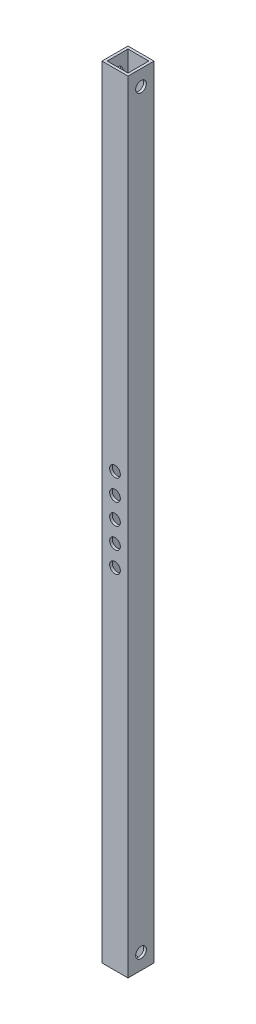
ISO-10303-21;
HEADER;
FILE_DESCRIPTION(('STEP AP214'),'2;1');
FILE_NAME('part.step','',(''),(''),'','','');
FILE_SCHEMA(('AUTOMOTIVE_DESIGN { 1 0 10303 214 1 1 1 1 }'));
ENDSEC;
DATA;
#1=APPLICATION_CONTEXT('core data for automotive mechanical design processes');
#2=APPLICATION_PROTOCOL_DEFINITION('international standard','automotive_design',2000,#1);
#3=PRODUCT_CONTEXT('',#1,'mechanical');
#4=PRODUCT('Part','Part','',(#3));
#5=PRODUCT_RELATED_PRODUCT_CATEGORY('part','',(#4));
#6=PRODUCT_DEFINITION_FORMATION('','',#4);
#7=PRODUCT_DEFINITION_CONTEXT('part definition',#1,'design');
#8=PRODUCT_DEFINITION('design','',#6,#7);
#9=PRODUCT_DEFINITION_SHAPE('','',#8);
#10=(LENGTH_UNIT() NAMED_UNIT(*) SI_UNIT(.MILLI.,.METRE.));
#11=(NAMED_UNIT(*) PLANE_ANGLE_UNIT() SI_UNIT($,.RADIAN.));
#12=(NAMED_UNIT(*) SI_UNIT($,.STERADIAN.) SOLID_ANGLE_UNIT());
#13=UNCERTAINTY_MEASURE_WITH_UNIT(LENGTH_MEASURE(1.E-05),#10,'distance_accuracy_value','');
#14=(GEOMETRIC_REPRESENTATION_CONTEXT(3) GLOBAL_UNCERTAINTY_ASSIGNED_CONTEXT((#13)) GLOBAL_UNIT_ASSIGNED_CONTEXT((#10,
#11,#12)) REPRESENTATION_CONTEXT('',''));
#15=CARTESIAN_POINT('',(0.,0.,0.));
#16=DIRECTION('',(0.,0.,1.));
#17=DIRECTION('',(1.,0.,0.));
#18=AXIS2_PLACEMENT_3D('',#15,#16,#17);
#19=CARTESIAN_POINT('',(0.,300.,0.));
#20=DIRECTION('',(0.,1.,0.));
#21=DIRECTION('',(0.,0.,1.));
#22=AXIS2_PLACEMENT_3D('',#19,#20,#21);
#23=PLANE('',#22);
#24=DIRECTION('',(0.,0.,-1.));
#25=VECTOR('',#24,1.);
#26=CARTESIAN_POINT('',(5.,300.,-5.));
#27=LINE('',#26,#25);
#28=CARTESIAN_POINT('',(5.,300.,5.));
#29=VERTEX_POINT('',#28);
#30=CARTESIAN_POINT('',(5.,300.,-5.));
#31=VERTEX_POINT('',#30);
#32=EDGE_CURVE('E142',#29,#31,#27,.T.);
#33=ORIENTED_EDGE('',*,*,#32,.T.);
#34=DIRECTION('',(-1.,0.,0.));
#35=VECTOR('',#34,1.);
#36=CARTESIAN_POINT('',(-5.,300.,-5.));
#37=LINE('',#36,#35);
#38=CARTESIAN_POINT('',(-5.,300.,-5.));
#39=VERTEX_POINT('',#38);
#40=EDGE_CURVE('E145',#31,#39,#37,.T.);
#41=ORIENTED_EDGE('',*,*,#40,.T.);
#42=DIRECTION('',(0.,0.,1.));
#43=VECTOR('',#42,1.);
#44=CARTESIAN_POINT('',(-5.,300.,-5.));
#45=LINE('',#44,#43);
#46=CARTESIAN_POINT('',(-5.,300.,5.));
#47=VERTEX_POINT('',#46);
#48=EDGE_CURVE('E148',#39,#47,#45,.T.);
#49=ORIENTED_EDGE('',*,*,#48,.T.);
#50=DIRECTION('',(1.,0.,0.));
#51=VECTOR('',#50,1.);
#52=CARTESIAN_POINT('',(-5.,300.,5.));
#53=LINE('',#52,#51);
#54=EDGE_CURVE('E150',#47,#29,#53,.T.);
#55=ORIENTED_EDGE('',*,*,#54,.T.);
#56=EDGE_LOOP('',(#33,#41,#49,#55));
#57=FACE_BOUND('',#56,.T.);
#58=DIRECTION('',(-1.,0.,0.));
#59=VECTOR('',#58,1.);
#60=CARTESIAN_POINT('',(-4.,300.,-4.));
#61=LINE('',#60,#59);
#62=CARTESIAN_POINT('',(4.,300.,-4.));
#63=VERTEX_POINT('',#62);
#64=CARTESIAN_POINT('',(-4.,300.,-4.));
#65=VERTEX_POINT('',#64);
#66=EDGE_CURVE('E112',#63,#65,#61,.T.);
#67=ORIENTED_EDGE('',*,*,#66,.F.);
#68=DIRECTION('',(0.,0.,-1.));
#69=VECTOR('',#68,1.);
#70=CARTESIAN_POINT('',(4.,300.,-4.));
#71=LINE('',#70,#69);
#72=CARTESIAN_POINT('',(4.,300.,4.));
#73=VERTEX_POINT('',#72);
#74=EDGE_CURVE('E104',#73,#63,#71,.T.);
#75=ORIENTED_EDGE('',*,*,#74,.F.);
#76=DIRECTION('',(1.,0.,0.));
#77=VECTOR('',#76,1.);
#78=CARTESIAN_POINT('',(-4.,300.,4.));
#79=LINE('',#78,#77);
#80=CARTESIAN_POINT('',(-4.,300.,4.));
#81=VERTEX_POINT('',#80);
#82=EDGE_CURVE('E126',#81,#73,#79,.T.);
#83=ORIENTED_EDGE('',*,*,#82,.F.);
#84=DIRECTION('',(0.,0.,1.));
#85=VECTOR('',#84,1.);
#86=CARTESIAN_POINT('',(-4.,300.,-4.));
#87=LINE('',#86,#85);
#88=EDGE_CURVE('E124',#65,#81,#87,.T.);
#89=ORIENTED_EDGE('',*,*,#88,.F.);
#90=EDGE_LOOP('',(#67,#75,#83,#89));
#91=FACE_BOUND('',#90,.T.);
#92=ADVANCED_FACE('F37',(#57,#91),#23,.T.);
#93=CARTESIAN_POINT('',(0.,0.,0.));
#94=DIRECTION('',(0.,1.,0.));
#95=DIRECTION('',(0.,0.,1.));
#96=AXIS2_PLACEMENT_3D('',#93,#94,#95);
#97=PLANE('',#96);
#98=DIRECTION('',(0.,0.,-1.));
#99=VECTOR('',#98,1.);
#100=CARTESIAN_POINT('',(5.,0.,-5.));
#101=LINE('',#100,#99);
#102=CARTESIAN_POINT('',(5.,0.,5.));
#103=VERTEX_POINT('',#102);
#104=CARTESIAN_POINT('',(5.,0.,-5.));
#105=VERTEX_POINT('',#104);
#106=EDGE_CURVE('E120',#103,#105,#101,.T.);
#107=ORIENTED_EDGE('',*,*,#106,.F.);
#108=DIRECTION('',(1.,0.,0.));
#109=VECTOR('',#108,1.);
#110=CARTESIAN_POINT('',(-5.,0.,5.));
#111=LINE('',#110,#109);
#112=CARTESIAN_POINT('',(-5.,0.,5.));
#113=VERTEX_POINT('',#112);
#114=EDGE_CURVE('E146',#113,#103,#111,.T.);
#115=ORIENTED_EDGE('',*,*,#114,.F.);
#116=DIRECTION('',(0.,0.,1.));
#117=VECTOR('',#116,1.);
#118=CARTESIAN_POINT('',(-5.,0.,-5.));
#119=LINE('',#118,#117);
#120=CARTESIAN_POINT('',(-5.,0.,-5.));
#121=VERTEX_POINT('',#120);
#122=EDGE_CURVE('E157',#121,#113,#119,.T.);
#123=ORIENTED_EDGE('',*,*,#122,.F.);
#124=DIRECTION('',(-1.,0.,0.));
#125=VECTOR('',#124,1.);
#126=CARTESIAN_POINT('',(-5.,0.,-5.));
#127=LINE('',#126,#125);
#128=EDGE_CURVE('E155',#105,#121,#127,.T.);
#129=ORIENTED_EDGE('',*,*,#128,.F.);
#130=EDGE_LOOP('',(#107,#115,#123,#129));
#131=FACE_BOUND('',#130,.T.);
#132=DIRECTION('',(0.,0.,-1.));
#133=VECTOR('',#132,1.);
#134=CARTESIAN_POINT('',(4.,0.,-4.));
#135=LINE('',#134,#133);
#136=CARTESIAN_POINT('',(4.,0.,4.));
#137=VERTEX_POINT('',#136);
#138=CARTESIAN_POINT('',(4.,0.,-4.));
#139=VERTEX_POINT('',#138);
#140=EDGE_CURVE('E62',#137,#139,#135,.T.);
#141=ORIENTED_EDGE('',*,*,#140,.T.);
#142=DIRECTION('',(-1.,0.,0.));
#143=VECTOR('',#142,1.);
#144=CARTESIAN_POINT('',(-4.,0.,-4.));
#145=LINE('',#144,#143);
#146=CARTESIAN_POINT('',(-4.,0.,-4.));
#147=VERTEX_POINT('',#146);
#148=EDGE_CURVE('E119',#139,#147,#145,.T.);
#149=ORIENTED_EDGE('',*,*,#148,.T.);
#150=DIRECTION('',(0.,0.,1.));
#151=VECTOR('',#150,1.);
#152=CARTESIAN_POINT('',(-4.,0.,-4.));
#153=LINE('',#152,#151);
#154=CARTESIAN_POINT('',(-4.,0.,4.));
#155=VERTEX_POINT('',#154);
#156=EDGE_CURVE('E134',#147,#155,#153,.T.);
#157=ORIENTED_EDGE('',*,*,#156,.T.);
#158=DIRECTION('',(1.,0.,0.));
#159=VECTOR('',#158,1.);
#160=CARTESIAN_POINT('',(-4.,0.,4.));
#161=LINE('',#160,#159);
#162=EDGE_CURVE('E113',#155,#137,#161,.T.);
#163=ORIENTED_EDGE('',*,*,#162,.T.);
#164=EDGE_LOOP('',(#141,#149,#157,#163));
#165=FACE_BOUND('',#164,.T.);
#166=ADVANCED_FACE('F239',(#131,#165),#97,.F.);
#167=CARTESIAN_POINT('',(5.,300.,-5.));
#168=DIRECTION('',(-1.,0.,0.));
#169=DIRECTION('',(0.,0.,1.));
#170=AXIS2_PLACEMENT_3D('',#167,#168,#169);
#171=PLANE('',#170);
#172=CARTESIAN_POINT('',(5.,294.,0.));
#173=DIRECTION('',(1.,0.,0.));
#174=DIRECTION('',(0.,0.,-1.));
#175=AXIS2_PLACEMENT_3D('',#172,#173,#174);
#176=CIRCLE('',#175,2.05000000000001);
#177=CARTESIAN_POINT('',(5.,294.,-2.05));
#178=VERTEX_POINT('',#177);
#179=EDGE_CURVE('E207',#178,#178,#176,.T.);
#180=ORIENTED_EDGE('',*,*,#179,.F.);
#181=EDGE_LOOP('',(#180));
#182=FACE_BOUND('',#181,.T.);
#183=CARTESIAN_POINT('',(5.,6.00000000000001,0.));
#184=DIRECTION('',(1.,0.,0.));
#185=DIRECTION('',(0.,0.,1.));
#186=AXIS2_PLACEMENT_3D('',#183,#184,#185);
#187=CIRCLE('',#186,2.05);
#188=CARTESIAN_POINT('',(5.,6.00000000000001,2.05));
#189=VERTEX_POINT('',#188);
#190=EDGE_CURVE('E204',#189,#189,#187,.T.);
#191=ORIENTED_EDGE('',*,*,#190,.F.);
#192=EDGE_LOOP('',(#191));
#193=FACE_BOUND('',#192,.T.);
#194=ORIENTED_EDGE('',*,*,#106,.T.);
#195=DIRECTION('',(0.,-1.,0.));
#196=VECTOR('',#195,1.);
#197=CARTESIAN_POINT('',(5.,300.,-5.));
#198=LINE('',#197,#196);
#199=EDGE_CURVE('E11',#31,#105,#198,.T.);
#200=ORIENTED_EDGE('',*,*,#199,.F.);
#201=ORIENTED_EDGE('',*,*,#32,.F.);
#202=DIRECTION('',(0.,-1.,0.));
#203=VECTOR('',#202,1.);
#204=CARTESIAN_POINT('',(5.,300.,5.));
#205=LINE('',#204,#203);
#206=EDGE_CURVE('E152',#29,#103,#205,.T.);
#207=ORIENTED_EDGE('',*,*,#206,.T.);
#208=EDGE_LOOP('',(#194,#200,#201,#207));
#209=FACE_BOUND('',#208,.T.);
#210=ADVANCED_FACE('F39',(#182,#193,#209),#171,.F.);
#211=CARTESIAN_POINT('',(-5.,300.,-5.));
#212=DIRECTION('',(0.,0.,1.));
#213=DIRECTION('',(1.,0.,0.));
#214=AXIS2_PLACEMENT_3D('',#211,#212,#213);
#215=PLANE('',#214);
#216=CARTESIAN_POINT('',(1.77019727681013E-13,134.,-5.));
#217=DIRECTION('',(0.,0.,1.));
#218=DIRECTION('',(1.,0.,0.));
#219=AXIS2_PLACEMENT_3D('',#216,#217,#218);
#220=CIRCLE('',#219,2.05);
#221=CARTESIAN_POINT('',(2.05000000000017,134.,-5.));
#222=VERTEX_POINT('',#221);
#223=EDGE_CURVE('E352',#222,#222,#220,.T.);
#224=ORIENTED_EDGE('',*,*,#223,.T.);
#225=EDGE_LOOP('',(#224));
#226=FACE_BOUND('',#225,.T.);
#227=CARTESIAN_POINT('',(0.,142.,-5.));
#228=DIRECTION('',(0.,0.,1.));
#229=DIRECTION('',(1.,0.,0.));
#230=AXIS2_PLACEMENT_3D('',#227,#228,#229);
#231=CIRCLE('',#230,2.05);
#232=CARTESIAN_POINT('',(2.05000000000009,142.,-5.));
#233=VERTEX_POINT('',#232);
#234=EDGE_CURVE('E346',#233,#233,#231,.T.);
#235=ORIENTED_EDGE('',*,*,#234,.T.);
#236=EDGE_LOOP('',(#235));
#237=FACE_BOUND('',#236,.T.);
#238=CARTESIAN_POINT('',(0.,166.,-5.));
#239=DIRECTION('',(0.,0.,1.));
#240=DIRECTION('',(1.,0.,0.));
#241=AXIS2_PLACEMENT_3D('',#238,#239,#240);
#242=CIRCLE('',#241,2.05);
#243=CARTESIAN_POINT('',(2.04999999999995,166.,-5.));
#244=VERTEX_POINT('',#243);
#245=EDGE_CURVE('E338',#244,#244,#242,.T.);
#246=ORIENTED_EDGE('',*,*,#245,.T.);
#247=EDGE_LOOP('',(#246));
#248=FACE_BOUND('',#247,.T.);
#249=CARTESIAN_POINT('',(0.,158.,-5.));
#250=DIRECTION('',(0.,0.,1.));
#251=DIRECTION('',(1.,0.,0.));
#252=AXIS2_PLACEMENT_3D('',#249,#250,#251);
#253=CIRCLE('',#252,2.05);
#254=CARTESIAN_POINT('',(2.04999999999998,158.,-5.));
#255=VERTEX_POINT('',#254);
#256=EDGE_CURVE('E330',#255,#255,#253,.T.);
#257=ORIENTED_EDGE('',*,*,#256,.T.);
#258=EDGE_LOOP('',(#257));
#259=FACE_BOUND('',#258,.T.);
#260=CARTESIAN_POINT('',(0.,150.,-5.));
#261=DIRECTION('',(0.,0.,1.));
#262=DIRECTION('',(1.,0.,0.));
#263=AXIS2_PLACEMENT_3D('',#260,#261,#262);
#264=CIRCLE('',#263,2.05);
#265=CARTESIAN_POINT('',(2.05000000000001,150.,-5.));
#266=VERTEX_POINT('',#265);
#267=EDGE_CURVE('E179',#266,#266,#264,.T.);
#268=ORIENTED_EDGE('',*,*,#267,.T.);
#269=EDGE_LOOP('',(#268));
#270=FACE_BOUND('',#269,.T.);
#271=ORIENTED_EDGE('',*,*,#128,.T.);
#272=DIRECTION('',(0.,-1.,0.));
#273=VECTOR('',#272,1.);
#274=CARTESIAN_POINT('',(-5.,300.,-5.));
#275=LINE('',#274,#273);
#276=EDGE_CURVE('E46',#39,#121,#275,.T.);
#277=ORIENTED_EDGE('',*,*,#276,.F.);
#278=ORIENTED_EDGE('',*,*,#40,.F.);
#279=ORIENTED_EDGE('',*,*,#199,.T.);
#280=EDGE_LOOP('',(#271,#277,#278,#279));
#281=FACE_BOUND('',#280,.T.);
#282=ADVANCED_FACE('F238',(#226,#237,#248,#259,#270,#281),#215,.F.);
#283=CARTESIAN_POINT('',(-5.,300.,-5.));
#284=DIRECTION('',(1.,0.,0.));
#285=DIRECTION('',(0.,0.,-1.));
#286=AXIS2_PLACEMENT_3D('',#283,#284,#285);
#287=PLANE('',#286);
#288=CARTESIAN_POINT('',(-5.,294.,0.));
#289=DIRECTION('',(1.,0.,0.));
#290=DIRECTION('',(0.,0.,-1.));
#291=AXIS2_PLACEMENT_3D('',#288,#289,#290);
#292=CIRCLE('',#291,2.05000000000001);
#293=CARTESIAN_POINT('',(-5.,294.,-2.05));
#294=VERTEX_POINT('',#293);
#295=EDGE_CURVE('E171',#294,#294,#292,.T.);
#296=ORIENTED_EDGE('',*,*,#295,.T.);
#297=EDGE_LOOP('',(#296));
#298=FACE_BOUND('',#297,.T.);
#299=CARTESIAN_POINT('',(-5.,6.00000000000001,0.));
#300=DIRECTION('',(1.,0.,0.));
#301=DIRECTION('',(0.,0.,1.));
#302=AXIS2_PLACEMENT_3D('',#299,#300,#301);
#303=CIRCLE('',#302,2.05);
#304=CARTESIAN_POINT('',(-5.,6.00000000000001,2.05));
#305=VERTEX_POINT('',#304);
#306=EDGE_CURVE('E210',#305,#305,#303,.T.);
#307=ORIENTED_EDGE('',*,*,#306,.T.);
#308=EDGE_LOOP('',(#307));
#309=FACE_BOUND('',#308,.T.);
#310=ORIENTED_EDGE('',*,*,#122,.T.);
#311=DIRECTION('',(0.,-1.,0.));
#312=VECTOR('',#311,1.);
#313=CARTESIAN_POINT('',(-5.,300.,5.));
#314=LINE('',#313,#312);
#315=EDGE_CURVE('E162',#47,#113,#314,.T.);
#316=ORIENTED_EDGE('',*,*,#315,.F.);
#317=ORIENTED_EDGE('',*,*,#48,.F.);
#318=ORIENTED_EDGE('',*,*,#276,.T.);
#319=EDGE_LOOP('',(#310,#316,#317,#318));
#320=FACE_BOUND('',#319,.T.);
#321=ADVANCED_FACE('F257',(#298,#309,#320),#287,.F.);
#322=CARTESIAN_POINT('',(-5.,300.,5.));
#323=DIRECTION('',(0.,0.,-1.));
#324=DIRECTION('',(-1.,0.,0.));
#325=AXIS2_PLACEMENT_3D('',#322,#323,#324);
#326=PLANE('',#325);
#327=CARTESIAN_POINT('',(1.77019727681013E-13,134.,5.));
#328=DIRECTION('',(0.,0.,1.));
#329=DIRECTION('',(1.,0.,0.));
#330=AXIS2_PLACEMENT_3D('',#327,#328,#329);
#331=CIRCLE('',#330,2.05);
#332=CARTESIAN_POINT('',(2.05000000000017,134.,5.));
#333=VERTEX_POINT('',#332);
#334=EDGE_CURVE('E355',#333,#333,#331,.T.);
#335=ORIENTED_EDGE('',*,*,#334,.F.);
#336=EDGE_LOOP('',(#335));
#337=FACE_BOUND('',#336,.T.);
#338=CARTESIAN_POINT('',(0.,142.,5.));
#339=DIRECTION('',(0.,0.,1.));
#340=DIRECTION('',(1.,0.,0.));
#341=AXIS2_PLACEMENT_3D('',#338,#339,#340);
#342=CIRCLE('',#341,2.05);
#343=CARTESIAN_POINT('',(2.05000000000009,142.,5.));
#344=VERTEX_POINT('',#343);
#345=EDGE_CURVE('E349',#344,#344,#342,.T.);
#346=ORIENTED_EDGE('',*,*,#345,.F.);
#347=EDGE_LOOP('',(#346));
#348=FACE_BOUND('',#347,.T.);
#349=CARTESIAN_POINT('',(0.,166.,5.));
#350=DIRECTION('',(0.,0.,1.));
#351=DIRECTION('',(1.,0.,0.));
#352=AXIS2_PLACEMENT_3D('',#349,#350,#351);
#353=CIRCLE('',#352,2.05);
#354=CARTESIAN_POINT('',(2.04999999999995,166.,5.));
#355=VERTEX_POINT('',#354);
#356=EDGE_CURVE('E343',#355,#355,#353,.T.);
#357=ORIENTED_EDGE('',*,*,#356,.F.);
#358=EDGE_LOOP('',(#357));
#359=FACE_BOUND('',#358,.T.);
#360=CARTESIAN_POINT('',(0.,158.,5.));
#361=DIRECTION('',(0.,0.,1.));
#362=DIRECTION('',(1.,0.,0.));
#363=AXIS2_PLACEMENT_3D('',#360,#361,#362);
#364=CIRCLE('',#363,2.05);
#365=CARTESIAN_POINT('',(2.04999999999998,158.,5.));
#366=VERTEX_POINT('',#365);
#367=EDGE_CURVE('E333',#366,#366,#364,.T.);
#368=ORIENTED_EDGE('',*,*,#367,.F.);
#369=EDGE_LOOP('',(#368));
#370=FACE_BOUND('',#369,.T.);
#371=CARTESIAN_POINT('',(0.,150.,5.));
#372=DIRECTION('',(0.,0.,1.));
#373=DIRECTION('',(1.,0.,0.));
#374=AXIS2_PLACEMENT_3D('',#371,#372,#373);
#375=CIRCLE('',#374,2.05);
#376=CARTESIAN_POINT('',(2.05000000000001,150.,5.));
#377=VERTEX_POINT('',#376);
#378=EDGE_CURVE('E332',#377,#377,#375,.T.);
#379=ORIENTED_EDGE('',*,*,#378,.F.);
#380=EDGE_LOOP('',(#379));
#381=FACE_BOUND('',#380,.T.);
#382=ORIENTED_EDGE('',*,*,#114,.T.);
#383=ORIENTED_EDGE('',*,*,#206,.F.);
#384=ORIENTED_EDGE('',*,*,#54,.F.);
#385=ORIENTED_EDGE('',*,*,#315,.T.);
#386=EDGE_LOOP('',(#382,#383,#384,#385));
#387=FACE_BOUND('',#386,.T.);
#388=ADVANCED_FACE('F224',(#337,#348,#359,#370,#381,#387),#326,.F.);
#389=CARTESIAN_POINT('',(4.,300.,-4.));
#390=DIRECTION('',(-1.,0.,0.));
#391=DIRECTION('',(0.,0.,1.));
#392=AXIS2_PLACEMENT_3D('',#389,#390,#391);
#393=PLANE('',#392);
#394=CARTESIAN_POINT('',(4.,294.,0.));
#395=DIRECTION('',(-1.,0.,0.));
#396=DIRECTION('',(0.,0.,1.));
#397=AXIS2_PLACEMENT_3D('',#394,#395,#396);
#398=CIRCLE('',#397,2.05000000000001);
#399=CARTESIAN_POINT('',(4.,294.,2.05000000000002));
#400=VERTEX_POINT('',#399);
#401=EDGE_CURVE('E132',#400,#400,#398,.T.);
#402=ORIENTED_EDGE('',*,*,#401,.F.);
#403=EDGE_LOOP('',(#402));
#404=FACE_BOUND('',#403,.T.);
#405=CARTESIAN_POINT('',(4.,6.00000000000001,0.));
#406=DIRECTION('',(-1.,0.,0.));
#407=DIRECTION('',(0.,0.,1.));
#408=AXIS2_PLACEMENT_3D('',#405,#406,#407);
#409=CIRCLE('',#408,2.05);
#410=CARTESIAN_POINT('',(4.,6.00000000000001,2.05));
#411=VERTEX_POINT('',#410);
#412=EDGE_CURVE('E170',#411,#411,#409,.T.);
#413=ORIENTED_EDGE('',*,*,#412,.F.);
#414=EDGE_LOOP('',(#413));
#415=FACE_BOUND('',#414,.T.);
#416=ORIENTED_EDGE('',*,*,#140,.F.);
#417=DIRECTION('',(0.,-1.,0.));
#418=VECTOR('',#417,1.);
#419=CARTESIAN_POINT('',(4.,300.,4.));
#420=LINE('',#419,#418);
#421=EDGE_CURVE('E108',#73,#137,#420,.T.);
#422=ORIENTED_EDGE('',*,*,#421,.F.);
#423=ORIENTED_EDGE('',*,*,#74,.T.);
#424=DIRECTION('',(0.,-1.,0.));
#425=VECTOR('',#424,1.);
#426=CARTESIAN_POINT('',(4.,300.,-4.));
#427=LINE('',#426,#425);
#428=EDGE_CURVE('E107',#63,#139,#427,.T.);
#429=ORIENTED_EDGE('',*,*,#428,.T.);
#430=EDGE_LOOP('',(#416,#422,#423,#429));
#431=FACE_BOUND('',#430,.T.);
#432=ADVANCED_FACE('F106',(#404,#415,#431),#393,.T.);
#433=CARTESIAN_POINT('',(-4.,300.,-4.));
#434=DIRECTION('',(0.,0.,1.));
#435=DIRECTION('',(1.,0.,0.));
#436=AXIS2_PLACEMENT_3D('',#433,#434,#435);
#437=PLANE('',#436);
#438=CARTESIAN_POINT('',(1.77019727681013E-13,134.,-4.));
#439=DIRECTION('',(0.,0.,1.));
#440=DIRECTION('',(1.,0.,0.));
#441=AXIS2_PLACEMENT_3D('',#438,#439,#440);
#442=CIRCLE('',#441,2.05);
#443=CARTESIAN_POINT('',(2.05000000000017,134.,-4.));
#444=VERTEX_POINT('',#443);
#445=EDGE_CURVE('E201',#444,#444,#442,.T.);
#446=ORIENTED_EDGE('',*,*,#445,.F.);
#447=EDGE_LOOP('',(#446));
#448=FACE_BOUND('',#447,.T.);
#449=CARTESIAN_POINT('',(0.,142.,-4.));
#450=DIRECTION('',(0.,0.,1.));
#451=DIRECTION('',(1.,0.,0.));
#452=AXIS2_PLACEMENT_3D('',#449,#450,#451);
#453=CIRCLE('',#452,2.05);
#454=CARTESIAN_POINT('',(2.05000000000009,142.,-4.));
#455=VERTEX_POINT('',#454);
#456=EDGE_CURVE('E189',#455,#455,#453,.T.);
#457=ORIENTED_EDGE('',*,*,#456,.F.);
#458=EDGE_LOOP('',(#457));
#459=FACE_BOUND('',#458,.T.);
#460=CARTESIAN_POINT('',(0.,166.,-4.));
#461=DIRECTION('',(0.,0.,1.));
#462=DIRECTION('',(1.,0.,0.));
#463=AXIS2_PLACEMENT_3D('',#460,#461,#462);
#464=CIRCLE('',#463,2.05);
#465=CARTESIAN_POINT('',(2.04999999999995,166.,-4.));
#466=VERTEX_POINT('',#465);
#467=EDGE_CURVE('E186',#466,#466,#464,.T.);
#468=ORIENTED_EDGE('',*,*,#467,.F.);
#469=EDGE_LOOP('',(#468));
#470=FACE_BOUND('',#469,.T.);
#471=CARTESIAN_POINT('',(0.,158.,-4.));
#472=DIRECTION('',(0.,0.,1.));
#473=DIRECTION('',(1.,0.,0.));
#474=AXIS2_PLACEMENT_3D('',#471,#472,#473);
#475=CIRCLE('',#474,2.05);
#476=CARTESIAN_POINT('',(2.04999999999998,158.,-4.));
#477=VERTEX_POINT('',#476);
#478=EDGE_CURVE('E183',#477,#477,#475,.T.);
#479=ORIENTED_EDGE('',*,*,#478,.F.);
#480=EDGE_LOOP('',(#479));
#481=FACE_BOUND('',#480,.T.);
#482=CARTESIAN_POINT('',(0.,150.,-4.));
#483=DIRECTION('',(0.,0.,1.));
#484=DIRECTION('',(1.,0.,0.));
#485=AXIS2_PLACEMENT_3D('',#482,#483,#484);
#486=CIRCLE('',#485,2.05);
#487=CARTESIAN_POINT('',(2.05000000000001,150.,-4.));
#488=VERTEX_POINT('',#487);
#489=EDGE_CURVE('E178',#488,#488,#486,.T.);
#490=ORIENTED_EDGE('',*,*,#489,.F.);
#491=EDGE_LOOP('',(#490));
#492=FACE_BOUND('',#491,.T.);
#493=ORIENTED_EDGE('',*,*,#148,.F.);
#494=ORIENTED_EDGE('',*,*,#428,.F.);
#495=ORIENTED_EDGE('',*,*,#66,.T.);
#496=DIRECTION('',(0.,-1.,0.));
#497=VECTOR('',#496,1.);
#498=CARTESIAN_POINT('',(-4.,300.,-4.));
#499=LINE('',#498,#497);
#500=EDGE_CURVE('E121',#65,#147,#499,.T.);
#501=ORIENTED_EDGE('',*,*,#500,.T.);
#502=EDGE_LOOP('',(#493,#494,#495,#501));
#503=FACE_BOUND('',#502,.T.);
#504=ADVANCED_FACE('F116',(#448,#459,#470,#481,#492,#503),#437,.T.);
#505=CARTESIAN_POINT('',(-4.,300.,-4.));
#506=DIRECTION('',(1.,0.,0.));
#507=DIRECTION('',(0.,0.,-1.));
#508=AXIS2_PLACEMENT_3D('',#505,#506,#507);
#509=PLANE('',#508);
#510=CARTESIAN_POINT('',(-4.,294.,0.));
#511=DIRECTION('',(1.,0.,0.));
#512=DIRECTION('',(0.,0.,-1.));
#513=AXIS2_PLACEMENT_3D('',#510,#511,#512);
#514=CIRCLE('',#513,2.05000000000001);
#515=CARTESIAN_POINT('',(-4.,294.,-2.05));
#516=VERTEX_POINT('',#515);
#517=EDGE_CURVE('E172',#516,#516,#514,.T.);
#518=ORIENTED_EDGE('',*,*,#517,.F.);
#519=EDGE_LOOP('',(#518));
#520=FACE_BOUND('',#519,.T.);
#521=CARTESIAN_POINT('',(-4.,6.00000000000001,0.));
#522=DIRECTION('',(1.,0.,0.));
#523=DIRECTION('',(0.,0.,-1.));
#524=AXIS2_PLACEMENT_3D('',#521,#522,#523);
#525=CIRCLE('',#524,2.05);
#526=CARTESIAN_POINT('',(-4.,6.00000000000001,-2.05));
#527=VERTEX_POINT('',#526);
#528=EDGE_CURVE('E167',#527,#527,#525,.T.);
#529=ORIENTED_EDGE('',*,*,#528,.F.);
#530=EDGE_LOOP('',(#529));
#531=FACE_BOUND('',#530,.T.);
#532=ORIENTED_EDGE('',*,*,#156,.F.);
#533=ORIENTED_EDGE('',*,*,#500,.F.);
#534=ORIENTED_EDGE('',*,*,#88,.T.);
#535=DIRECTION('',(0.,-1.,0.));
#536=VECTOR('',#535,1.);
#537=CARTESIAN_POINT('',(-4.,300.,4.));
#538=LINE('',#537,#536);
#539=EDGE_CURVE('E54',#81,#155,#538,.T.);
#540=ORIENTED_EDGE('',*,*,#539,.T.);
#541=EDGE_LOOP('',(#532,#533,#534,#540));
#542=FACE_BOUND('',#541,.T.);
#543=ADVANCED_FACE('F278',(#520,#531,#542),#509,.T.);
#544=CARTESIAN_POINT('',(-4.,300.,4.));
#545=DIRECTION('',(0.,0.,-1.));
#546=DIRECTION('',(-1.,0.,0.));
#547=AXIS2_PLACEMENT_3D('',#544,#545,#546);
#548=PLANE('',#547);
#549=CARTESIAN_POINT('',(1.77019727681013E-13,134.,4.));
#550=DIRECTION('',(0.,0.,-1.));
#551=DIRECTION('',(-1.,0.,0.));
#552=AXIS2_PLACEMENT_3D('',#549,#550,#551);
#553=CIRCLE('',#552,2.05);
#554=CARTESIAN_POINT('',(-2.04999999999982,134.,4.));
#555=VERTEX_POINT('',#554);
#556=EDGE_CURVE('E41',#555,#555,#553,.T.);
#557=ORIENTED_EDGE('',*,*,#556,.F.);
#558=EDGE_LOOP('',(#557));
#559=FACE_BOUND('',#558,.T.);
#560=CARTESIAN_POINT('',(0.,142.,4.));
#561=DIRECTION('',(0.,0.,-1.));
#562=DIRECTION('',(-1.,0.,0.));
#563=AXIS2_PLACEMENT_3D('',#560,#561,#562);
#564=CIRCLE('',#563,2.05);
#565=CARTESIAN_POINT('',(-2.0499999999999,142.,4.));
#566=VERTEX_POINT('',#565);
#567=EDGE_CURVE('E187',#566,#566,#564,.T.);
#568=ORIENTED_EDGE('',*,*,#567,.F.);
#569=EDGE_LOOP('',(#568));
#570=FACE_BOUND('',#569,.T.);
#571=CARTESIAN_POINT('',(0.,166.,4.));
#572=DIRECTION('',(0.,0.,-1.));
#573=DIRECTION('',(-1.,0.,0.));
#574=AXIS2_PLACEMENT_3D('',#571,#572,#573);
#575=CIRCLE('',#574,2.05);
#576=CARTESIAN_POINT('',(-2.05000000000004,166.,4.));
#577=VERTEX_POINT('',#576);
#578=EDGE_CURVE('E184',#577,#577,#575,.T.);
#579=ORIENTED_EDGE('',*,*,#578,.F.);
#580=EDGE_LOOP('',(#579));
#581=FACE_BOUND('',#580,.T.);
#582=CARTESIAN_POINT('',(0.,158.,4.));
#583=DIRECTION('',(0.,0.,-1.));
#584=DIRECTION('',(-1.,0.,0.));
#585=AXIS2_PLACEMENT_3D('',#582,#583,#584);
#586=CIRCLE('',#585,2.05);
#587=CARTESIAN_POINT('',(-2.05000000000001,158.,4.));
#588=VERTEX_POINT('',#587);
#589=EDGE_CURVE('E180',#588,#588,#586,.T.);
#590=ORIENTED_EDGE('',*,*,#589,.F.);
#591=EDGE_LOOP('',(#590));
#592=FACE_BOUND('',#591,.T.);
#593=CARTESIAN_POINT('',(0.,150.,4.));
#594=DIRECTION('',(0.,0.,-1.));
#595=DIRECTION('',(-1.,0.,0.));
#596=AXIS2_PLACEMENT_3D('',#593,#594,#595);
#597=CIRCLE('',#596,2.05);
#598=CARTESIAN_POINT('',(-2.04999999999999,150.,4.));
#599=VERTEX_POINT('',#598);
#600=EDGE_CURVE('E175',#599,#599,#597,.T.);
#601=ORIENTED_EDGE('',*,*,#600,.F.);
#602=EDGE_LOOP('',(#601));
#603=FACE_BOUND('',#602,.T.);
#604=ORIENTED_EDGE('',*,*,#162,.F.);
#605=ORIENTED_EDGE('',*,*,#539,.F.);
#606=ORIENTED_EDGE('',*,*,#82,.T.);
#607=ORIENTED_EDGE('',*,*,#421,.T.);
#608=EDGE_LOOP('',(#604,#605,#606,#607));
#609=FACE_BOUND('',#608,.T.);
#610=ADVANCED_FACE('F282',(#559,#570,#581,#592,#603,#609),#548,.T.);
#611=CARTESIAN_POINT('',(-5.,6.00000000000001,0.));
#612=DIRECTION('',(1.,0.,0.));
#613=DIRECTION('',(0.,0.,-1.));
#614=AXIS2_PLACEMENT_3D('',#611,#612,#613);
#615=CYLINDRICAL_SURFACE('',#614,2.05);
#616=ORIENTED_EDGE('',*,*,#528,.T.);
#617=EDGE_LOOP('',(#616));
#618=FACE_BOUND('',#617,.T.);
#619=ORIENTED_EDGE('',*,*,#306,.F.);
#620=EDGE_LOOP('',(#619));
#621=FACE_BOUND('',#620,.T.);
#622=ADVANCED_FACE('F233',(#618,#621),#615,.F.);
#623=CARTESIAN_POINT('',(-5.,294.,0.));
#624=DIRECTION('',(1.,0.,0.));
#625=DIRECTION('',(0.,0.,-1.));
#626=AXIS2_PLACEMENT_3D('',#623,#624,#625);
#627=CYLINDRICAL_SURFACE('',#626,2.05000000000001);
#628=ORIENTED_EDGE('',*,*,#517,.T.);
#629=EDGE_LOOP('',(#628));
#630=FACE_BOUND('',#629,.T.);
#631=ORIENTED_EDGE('',*,*,#295,.F.);
#632=EDGE_LOOP('',(#631));
#633=FACE_BOUND('',#632,.T.);
#634=ADVANCED_FACE('F231',(#630,#633),#627,.F.);
#635=ORIENTED_EDGE('',*,*,#412,.T.);
#636=EDGE_LOOP('',(#635));
#637=FACE_BOUND('',#636,.T.);
#638=ORIENTED_EDGE('',*,*,#190,.T.);
#639=EDGE_LOOP('',(#638));
#640=FACE_BOUND('',#639,.T.);
#641=ADVANCED_FACE('F228',(#637,#640),#615,.F.);
#642=ORIENTED_EDGE('',*,*,#401,.T.);
#643=EDGE_LOOP('',(#642));
#644=FACE_BOUND('',#643,.T.);
#645=ORIENTED_EDGE('',*,*,#179,.T.);
#646=EDGE_LOOP('',(#645));
#647=FACE_BOUND('',#646,.T.);
#648=ADVANCED_FACE('F219',(#644,#647),#627,.F.);
#649=CARTESIAN_POINT('',(0.,150.,-5.));
#650=DIRECTION('',(0.,0.,1.));
#651=DIRECTION('',(1.,0.,0.));
#652=AXIS2_PLACEMENT_3D('',#649,#650,#651);
#653=CYLINDRICAL_SURFACE('',#652,2.05);
#654=ORIENTED_EDGE('',*,*,#600,.T.);
#655=EDGE_LOOP('',(#654));
#656=FACE_BOUND('',#655,.T.);
#657=ORIENTED_EDGE('',*,*,#378,.T.);
#658=EDGE_LOOP('',(#657));
#659=FACE_BOUND('',#658,.T.);
#660=ADVANCED_FACE('F292',(#656,#659),#653,.F.);
#661=CARTESIAN_POINT('',(0.,158.,-5.));
#662=DIRECTION('',(0.,0.,1.));
#663=DIRECTION('',(1.,0.,0.));
#664=AXIS2_PLACEMENT_3D('',#661,#662,#663);
#665=CYLINDRICAL_SURFACE('',#664,2.05);
#666=ORIENTED_EDGE('',*,*,#589,.T.);
#667=EDGE_LOOP('',(#666));
#668=FACE_BOUND('',#667,.T.);
#669=ORIENTED_EDGE('',*,*,#367,.T.);
#670=EDGE_LOOP('',(#669));
#671=FACE_BOUND('',#670,.T.);
#672=ADVANCED_FACE('F295',(#668,#671),#665,.F.);
#673=CARTESIAN_POINT('',(0.,166.,-5.));
#674=DIRECTION('',(0.,0.,1.));
#675=DIRECTION('',(1.,0.,0.));
#676=AXIS2_PLACEMENT_3D('',#673,#674,#675);
#677=CYLINDRICAL_SURFACE('',#676,2.05);
#678=ORIENTED_EDGE('',*,*,#578,.T.);
#679=EDGE_LOOP('',(#678));
#680=FACE_BOUND('',#679,.T.);
#681=ORIENTED_EDGE('',*,*,#356,.T.);
#682=EDGE_LOOP('',(#681));
#683=FACE_BOUND('',#682,.T.);
#684=ADVANCED_FACE('F306',(#680,#683),#677,.F.);
#685=CARTESIAN_POINT('',(0.,142.,-5.));
#686=DIRECTION('',(0.,0.,1.));
#687=DIRECTION('',(1.,0.,0.));
#688=AXIS2_PLACEMENT_3D('',#685,#686,#687);
#689=CYLINDRICAL_SURFACE('',#688,2.05);
#690=ORIENTED_EDGE('',*,*,#567,.T.);
#691=EDGE_LOOP('',(#690));
#692=FACE_BOUND('',#691,.T.);
#693=ORIENTED_EDGE('',*,*,#345,.T.);
#694=EDGE_LOOP('',(#693));
#695=FACE_BOUND('',#694,.T.);
#696=ADVANCED_FACE('F301',(#692,#695),#689,.F.);
#697=CARTESIAN_POINT('',(1.77019727681013E-13,134.,-5.));
#698=DIRECTION('',(0.,0.,1.));
#699=DIRECTION('',(1.,0.,0.));
#700=AXIS2_PLACEMENT_3D('',#697,#698,#699);
#701=CYLINDRICAL_SURFACE('',#700,2.05);
#702=ORIENTED_EDGE('',*,*,#556,.T.);
#703=EDGE_LOOP('',(#702));
#704=FACE_BOUND('',#703,.T.);
#705=ORIENTED_EDGE('',*,*,#334,.T.);
#706=EDGE_LOOP('',(#705));
#707=FACE_BOUND('',#706,.T.);
#708=ADVANCED_FACE('F298',(#704,#707),#701,.F.);
#709=ORIENTED_EDGE('',*,*,#489,.T.);
#710=EDGE_LOOP('',(#709));
#711=FACE_BOUND('',#710,.T.);
#712=ORIENTED_EDGE('',*,*,#267,.F.);
#713=EDGE_LOOP('',(#712));
#714=FACE_BOUND('',#713,.T.);
#715=ADVANCED_FACE('F297',(#711,#714),#653,.F.);
#716=ORIENTED_EDGE('',*,*,#478,.T.);
#717=EDGE_LOOP('',(#716));
#718=FACE_BOUND('',#717,.T.);
#719=ORIENTED_EDGE('',*,*,#256,.F.);
#720=EDGE_LOOP('',(#719));
#721=FACE_BOUND('',#720,.T.);
#722=ADVANCED_FACE('F314',(#718,#721),#665,.F.);
#723=ORIENTED_EDGE('',*,*,#467,.T.);
#724=EDGE_LOOP('',(#723));
#725=FACE_BOUND('',#724,.T.);
#726=ORIENTED_EDGE('',*,*,#245,.F.);
#727=EDGE_LOOP('',(#726));
#728=FACE_BOUND('',#727,.T.);
#729=ADVANCED_FACE('F311',(#725,#728),#677,.F.);
#730=ORIENTED_EDGE('',*,*,#456,.T.);
#731=EDGE_LOOP('',(#730));
#732=FACE_BOUND('',#731,.T.);
#733=ORIENTED_EDGE('',*,*,#234,.F.);
#734=EDGE_LOOP('',(#733));
#735=FACE_BOUND('',#734,.T.);
#736=ADVANCED_FACE('F307',(#732,#735),#689,.F.);
#737=ORIENTED_EDGE('',*,*,#445,.T.);
#738=EDGE_LOOP('',(#737));
#739=FACE_BOUND('',#738,.T.);
#740=ORIENTED_EDGE('',*,*,#223,.F.);
#741=EDGE_LOOP('',(#740));
#742=FACE_BOUND('',#741,.T.);
#743=ADVANCED_FACE('F303',(#739,#742),#701,.F.);
#744=CLOSED_SHELL('',(#92,#166,#210,#282,#321,#388,#432,#504,#543,#610,#622,#634,#641,#648,#660,
#672,#684,#696,#708,#715,#722,#729,#736,#743));
#745=MANIFOLD_SOLID_BREP('B2',#744);
#746=ADVANCED_BREP_SHAPE_REPRESENTATION('',(#18,#745),#14);
#747=SHAPE_DEFINITION_REPRESENTATION(#9,#746);
ENDSEC;
END-ISO-10303-21;
